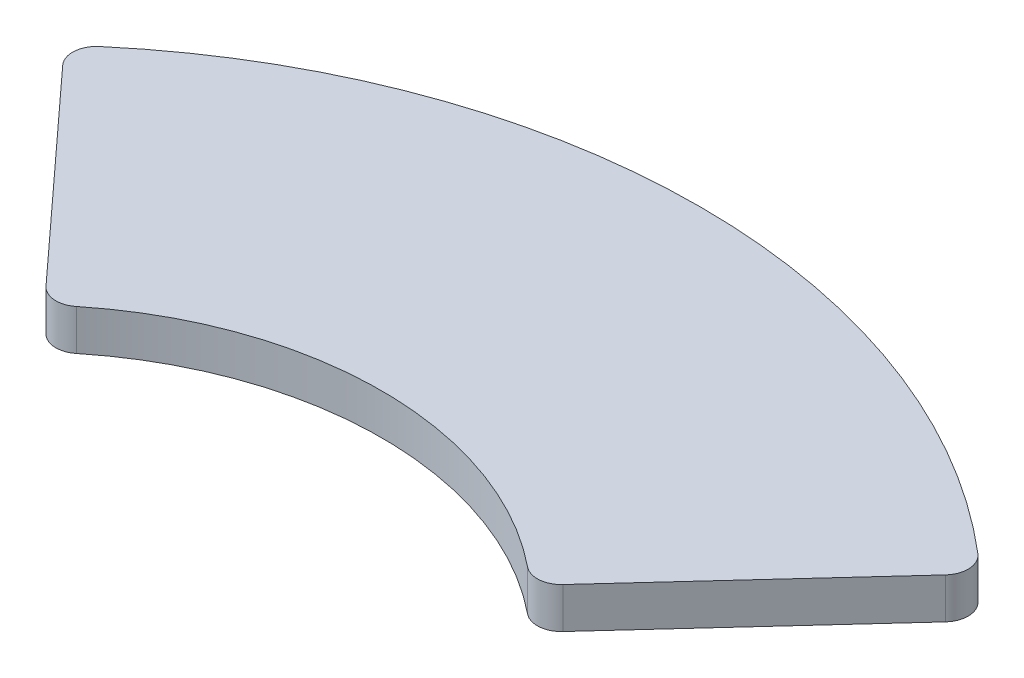
ISO-10303-21;
HEADER;
FILE_DESCRIPTION(('STEP AP214'),'2;1');
FILE_NAME('part.step','',(''),(''),'','','');
FILE_SCHEMA(('AUTOMOTIVE_DESIGN { 1 0 10303 214 1 1 1 1 }'));
ENDSEC;
DATA;
#1=APPLICATION_CONTEXT('core data for automotive mechanical design processes');
#2=APPLICATION_PROTOCOL_DEFINITION('international standard','automotive_design',2000,#1);
#3=PRODUCT_CONTEXT('',#1,'mechanical');
#4=PRODUCT('Part','Part','',(#3));
#5=PRODUCT_RELATED_PRODUCT_CATEGORY('part','',(#4));
#6=PRODUCT_DEFINITION_FORMATION('','',#4);
#7=PRODUCT_DEFINITION_CONTEXT('part definition',#1,'design');
#8=PRODUCT_DEFINITION('design','',#6,#7);
#9=PRODUCT_DEFINITION_SHAPE('','',#8);
#10=(LENGTH_UNIT() NAMED_UNIT(*) SI_UNIT(.MILLI.,.METRE.));
#11=(NAMED_UNIT(*) PLANE_ANGLE_UNIT() SI_UNIT($,.RADIAN.));
#12=(NAMED_UNIT(*) SI_UNIT($,.STERADIAN.) SOLID_ANGLE_UNIT());
#13=UNCERTAINTY_MEASURE_WITH_UNIT(LENGTH_MEASURE(1.E-05),#10,'distance_accuracy_value','');
#14=(GEOMETRIC_REPRESENTATION_CONTEXT(3) GLOBAL_UNCERTAINTY_ASSIGNED_CONTEXT((#13)) GLOBAL_UNIT_ASSIGNED_CONTEXT((#10,
#11,#12)) REPRESENTATION_CONTEXT('',''));
#15=CARTESIAN_POINT('',(0.,0.,0.));
#16=DIRECTION('',(0.,0.,1.));
#17=DIRECTION('',(1.,0.,0.));
#18=AXIS2_PLACEMENT_3D('',#15,#16,#17);
#19=CARTESIAN_POINT('',(0.,0.85,21.65));
#20=DIRECTION('',(0.,-1.,0.));
#21=DIRECTION('',(0.,0.,-1.));
#22=AXIS2_PLACEMENT_3D('',#19,#20,#21);
#23=CYLINDRICAL_SURFACE('',#22,15.);
#24=CARTESIAN_POINT('',(0.,-0.85,21.65));
#25=DIRECTION('',(0.,-1.,0.));
#26=DIRECTION('',(0.,0.,-1.));
#27=AXIS2_PLACEMENT_3D('',#24,#25,#26);
#28=CIRCLE('',#27,15.);
#29=CARTESIAN_POINT('',(-9.42284356247684,-0.85,9.97909518515858));
#30=VERTEX_POINT('',#29);
#31=CARTESIAN_POINT('',(9.42284356247684,-0.85,9.97909518515858));
#32=VERTEX_POINT('',#31);
#33=EDGE_CURVE('E140',#30,#32,#28,.T.);
#34=ORIENTED_EDGE('',*,*,#33,.T.);
#35=DIRECTION('',(0.,-1.,0.));
#36=VECTOR('',#35,1.);
#37=CARTESIAN_POINT('',(9.42284356247684,0.85,9.97909518515858));
#38=LINE('',#37,#36);
#39=CARTESIAN_POINT('',(9.42284356247684,0.85,9.97909518515858));
#40=VERTEX_POINT('',#39);
#41=EDGE_CURVE('E174',#32,#40,#38,.F.);
#42=ORIENTED_EDGE('',*,*,#41,.T.);
#43=CARTESIAN_POINT('',(0.,0.85,21.65));
#44=DIRECTION('',(0.,-1.,0.));
#45=DIRECTION('',(0.,0.,-1.));
#46=AXIS2_PLACEMENT_3D('',#43,#44,#45);
#47=CIRCLE('',#46,15.);
#48=CARTESIAN_POINT('',(-9.42284356247684,0.85,9.97909518515858));
#49=VERTEX_POINT('',#48);
#50=EDGE_CURVE('E138',#49,#40,#47,.T.);
#51=ORIENTED_EDGE('',*,*,#50,.F.);
#52=DIRECTION('',(0.,-1.,0.));
#53=VECTOR('',#52,1.);
#54=CARTESIAN_POINT('',(-9.42284356247684,0.85,9.97909518515858));
#55=LINE('',#54,#53);
#56=EDGE_CURVE('E170',#49,#30,#55,.T.);
#57=ORIENTED_EDGE('',*,*,#56,.T.);
#58=EDGE_LOOP('',(#34,#42,#51,#57));
#59=FACE_BOUND('',#58,.T.);
#60=ADVANCED_FACE('F39',(#59),#23,.F.);
#61=CARTESIAN_POINT('',(10.1338531142349,0.85,10.5908399478482));
#62=DIRECTION('',(-0.737277336810123,0.,-0.675590207615661));
#63=DIRECTION('',(-0.675590207615661,0.,0.737277336810123));
#64=AXIS2_PLACEMENT_3D('',#61,#62,#63);
#65=PLANE('',#64);
#66=DIRECTION('',(0.675590207615661,0.,-0.737277336810123));
#67=VECTOR('',#66,1.);
#68=CARTESIAN_POINT('',(10.1338531142349,-0.85,10.5908399478482));
#69=LINE('',#68,#67);
#70=CARTESIAN_POINT('',(10.7883104701188,-0.85,9.87662507178481));
#71=VERTEX_POINT('',#70);
#72=CARTESIAN_POINT('',(18.431235067547,-0.85,1.53583648557996));
#73=VERTEX_POINT('',#72);
#74=EDGE_CURVE('E134',#71,#73,#69,.T.);
#75=ORIENTED_EDGE('',*,*,#74,.T.);
#76=DIRECTION('',(0.,-1.,0.));
#77=VECTOR('',#76,1.);
#78=CARTESIAN_POINT('',(18.431235067547,0.85,1.53583648557996));
#79=LINE('',#78,#77);
#80=CARTESIAN_POINT('',(18.431235067547,0.85,1.53583648557996));
#81=VERTEX_POINT('',#80);
#82=EDGE_CURVE('E110',#73,#81,#79,.F.);
#83=ORIENTED_EDGE('',*,*,#82,.T.);
#84=DIRECTION('',(0.675590207615661,0.,-0.737277336810123));
#85=VECTOR('',#84,1.);
#86=CARTESIAN_POINT('',(10.1338531142349,0.85,10.5908399478482));
#87=LINE('',#86,#85);
#88=CARTESIAN_POINT('',(10.7883104701188,0.85,9.87662507178481));
#89=VERTEX_POINT('',#88);
#90=EDGE_CURVE('E193',#89,#81,#87,.T.);
#91=ORIENTED_EDGE('',*,*,#90,.F.);
#92=DIRECTION('',(0.,-1.,0.));
#93=VECTOR('',#92,1.);
#94=CARTESIAN_POINT('',(10.7883104701188,0.85,9.87662507178481));
#95=LINE('',#94,#93);
#96=EDGE_CURVE('E116',#89,#71,#95,.T.);
#97=ORIENTED_EDGE('',*,*,#96,.T.);
#98=EDGE_LOOP('',(#75,#83,#91,#97));
#99=FACE_BOUND('',#98,.T.);
#100=ADVANCED_FACE('F214',(#99),#65,.F.);
#101=CARTESIAN_POINT('',(0.,0.85,21.65));
#102=DIRECTION('',(0.,-1.,0.));
#103=DIRECTION('',(0.,0.,-1.));
#104=AXIS2_PLACEMENT_3D('',#101,#102,#103);
#105=CYLINDRICAL_SURFACE('',#104,28.3);
#106=CARTESIAN_POINT('',(0.,0.85,21.65));
#107=DIRECTION('',(0.,1.,0.));
#108=DIRECTION('',(0.,0.,-1.));
#109=AXIS2_PLACEMENT_3D('',#106,#107,#108);
#110=CIRCLE('',#109,28.3);
#111=CARTESIAN_POINT('',(18.3420880505441,0.85,0.0987168375967025));
#112=VERTEX_POINT('',#111);
#113=CARTESIAN_POINT('',(-18.3420880505441,0.85,0.0987168375967025));
#114=VERTEX_POINT('',#113);
#115=EDGE_CURVE('E125',#112,#114,#110,.T.);
#116=ORIENTED_EDGE('',*,*,#115,.F.);
#117=DIRECTION('',(0.,-1.,0.));
#118=VECTOR('',#117,1.);
#119=CARTESIAN_POINT('',(18.3420880505441,0.85,0.0987168375966956));
#120=LINE('',#119,#118);
#121=CARTESIAN_POINT('',(18.3420880505441,-0.85,0.0987168375967025));
#122=VERTEX_POINT('',#121);
#123=EDGE_CURVE('E109',#112,#122,#120,.T.);
#124=ORIENTED_EDGE('',*,*,#123,.T.);
#125=CARTESIAN_POINT('',(0.,-0.85,21.65));
#126=DIRECTION('',(0.,1.,0.));
#127=DIRECTION('',(0.,0.,-1.));
#128=AXIS2_PLACEMENT_3D('',#125,#126,#127);
#129=CIRCLE('',#128,28.3);
#130=CARTESIAN_POINT('',(-18.3420880505441,-0.85,0.0987168375967025));
#131=VERTEX_POINT('',#130);
#132=EDGE_CURVE('E123',#122,#131,#129,.T.);
#133=ORIENTED_EDGE('',*,*,#132,.T.);
#134=DIRECTION('',(0.,-1.,0.));
#135=VECTOR('',#134,1.);
#136=CARTESIAN_POINT('',(-18.3420880505441,0.85,0.098716837596699));
#137=LINE('',#136,#135);
#138=EDGE_CURVE('E128',#131,#114,#137,.F.);
#139=ORIENTED_EDGE('',*,*,#138,.T.);
#140=EDGE_LOOP('',(#116,#124,#133,#139));
#141=FACE_BOUND('',#140,.T.);
#142=ADVANCED_FACE('F122',(#141),#105,.T.);
#143=CARTESIAN_POINT('',(-10.1338531142349,0.85,10.5908399478482));
#144=DIRECTION('',(0.737277336810123,0.,-0.675590207615661));
#145=DIRECTION('',(-0.675590207615661,0.,-0.737277336810123));
#146=AXIS2_PLACEMENT_3D('',#143,#144,#145);
#147=PLANE('',#146);
#148=DIRECTION('',(0.675590207615661,0.,0.737277336810123));
#149=VECTOR('',#148,1.);
#150=CARTESIAN_POINT('',(-10.1338531142349,-0.85,10.5908399478482));
#151=LINE('',#150,#149);
#152=CARTESIAN_POINT('',(-18.431235067547,-0.85,1.53583648557997));
#153=VERTEX_POINT('',#152);
#154=CARTESIAN_POINT('',(-10.7883104701188,-0.85,9.87662507178481));
#155=VERTEX_POINT('',#154);
#156=EDGE_CURVE('E133',#153,#155,#151,.T.);
#157=ORIENTED_EDGE('',*,*,#156,.T.);
#158=DIRECTION('',(0.,-1.,0.));
#159=VECTOR('',#158,1.);
#160=CARTESIAN_POINT('',(-10.7883104701188,0.85,9.87662507178481));
#161=LINE('',#160,#159);
#162=CARTESIAN_POINT('',(-10.7883104701188,0.85,9.87662507178481));
#163=VERTEX_POINT('',#162);
#164=EDGE_CURVE('E11',#155,#163,#161,.F.);
#165=ORIENTED_EDGE('',*,*,#164,.T.);
#166=DIRECTION('',(0.675590207615661,0.,0.737277336810123));
#167=VECTOR('',#166,1.);
#168=CARTESIAN_POINT('',(-10.1338531142349,0.85,10.5908399478482));
#169=LINE('',#168,#167);
#170=CARTESIAN_POINT('',(-18.431235067547,0.85,1.53583648557997));
#171=VERTEX_POINT('',#170);
#172=EDGE_CURVE('E145',#171,#163,#169,.T.);
#173=ORIENTED_EDGE('',*,*,#172,.F.);
#174=DIRECTION('',(0.,-1.,0.));
#175=VECTOR('',#174,1.);
#176=CARTESIAN_POINT('',(-18.431235067547,0.85,1.53583648557997));
#177=LINE('',#176,#175);
#178=EDGE_CURVE('E48',#171,#153,#177,.T.);
#179=ORIENTED_EDGE('',*,*,#178,.T.);
#180=EDGE_LOOP('',(#157,#165,#173,#179));
#181=FACE_BOUND('',#180,.T.);
#182=ADVANCED_FACE('F179',(#181),#147,.F.);
#183=CARTESIAN_POINT('',(0.,0.85,21.65));
#184=DIRECTION('',(0.,-1.,0.));
#185=DIRECTION('',(0.,0.,-1.));
#186=AXIS2_PLACEMENT_3D('',#183,#184,#185);
#187=PLANE('',#186);
#188=ORIENTED_EDGE('',*,*,#90,.T.);
#189=CARTESIAN_POINT('',(17.6939577307369,0.85,0.860246277964306));
#190=DIRECTION('',(0.,-1.,0.));
#191=DIRECTION('',(0.,0.,-1.));
#192=AXIS2_PLACEMENT_3D('',#189,#190,#191);
#193=CIRCLE('',#192,1.);
#194=EDGE_CURVE('E167',#81,#112,#193,.F.);
#195=ORIENTED_EDGE('',*,*,#194,.T.);
#196=ORIENTED_EDGE('',*,*,#115,.T.);
#197=CARTESIAN_POINT('',(-17.6939577307369,0.85,0.86024627796431));
#198=DIRECTION('',(0.,-1.,0.));
#199=DIRECTION('',(0.,0.,-1.));
#200=AXIS2_PLACEMENT_3D('',#197,#198,#199);
#201=CIRCLE('',#200,1.);
#202=EDGE_CURVE('E60',#114,#171,#201,.F.);
#203=ORIENTED_EDGE('',*,*,#202,.T.);
#204=ORIENTED_EDGE('',*,*,#172,.T.);
#205=CARTESIAN_POINT('',(-10.0510331333086,0.85,9.20103486416915));
#206=DIRECTION('',(0.,-1.,0.));
#207=DIRECTION('',(0.,0.,-1.));
#208=AXIS2_PLACEMENT_3D('',#205,#206,#207);
#209=CIRCLE('',#208,1.);
#210=EDGE_CURVE('E161',#163,#49,#209,.F.);
#211=ORIENTED_EDGE('',*,*,#210,.T.);
#212=ORIENTED_EDGE('',*,*,#50,.T.);
#213=CARTESIAN_POINT('',(10.0510331333086,0.85,9.20103486416915));
#214=DIRECTION('',(0.,-1.,0.));
#215=DIRECTION('',(0.,0.,-1.));
#216=AXIS2_PLACEMENT_3D('',#213,#214,#215);
#217=CIRCLE('',#216,1.);
#218=EDGE_CURVE('E164',#40,#89,#217,.F.);
#219=ORIENTED_EDGE('',*,*,#218,.T.);
#220=EDGE_LOOP('',(#188,#195,#196,#203,#204,#211,#212,#219));
#221=FACE_BOUND('',#220,.T.);
#222=ADVANCED_FACE('F203',(#221),#187,.F.);
#223=CARTESIAN_POINT('',(0.,-0.85,21.65));
#224=DIRECTION('',(0.,-1.,0.));
#225=DIRECTION('',(0.,0.,-1.));
#226=AXIS2_PLACEMENT_3D('',#223,#224,#225);
#227=PLANE('',#226);
#228=ORIENTED_EDGE('',*,*,#132,.F.);
#229=CARTESIAN_POINT('',(17.6939577307369,-0.85,0.860246277964306));
#230=DIRECTION('',(0.,-1.,0.));
#231=DIRECTION('',(0.,0.,-1.));
#232=AXIS2_PLACEMENT_3D('',#229,#230,#231);
#233=CIRCLE('',#232,1.);
#234=EDGE_CURVE('E105',#122,#73,#233,.T.);
#235=ORIENTED_EDGE('',*,*,#234,.T.);
#236=ORIENTED_EDGE('',*,*,#74,.F.);
#237=CARTESIAN_POINT('',(10.0510331333086,-0.85,9.20103486416915));
#238=DIRECTION('',(0.,-1.,0.));
#239=DIRECTION('',(0.,0.,-1.));
#240=AXIS2_PLACEMENT_3D('',#237,#238,#239);
#241=CIRCLE('',#240,1.);
#242=EDGE_CURVE('E117',#71,#32,#241,.T.);
#243=ORIENTED_EDGE('',*,*,#242,.T.);
#244=ORIENTED_EDGE('',*,*,#33,.F.);
#245=CARTESIAN_POINT('',(-10.0510331333086,-0.85,9.20103486416915));
#246=DIRECTION('',(0.,-1.,0.));
#247=DIRECTION('',(0.,0.,-1.));
#248=AXIS2_PLACEMENT_3D('',#245,#246,#247);
#249=CIRCLE('',#248,1.);
#250=EDGE_CURVE('E149',#30,#155,#249,.T.);
#251=ORIENTED_EDGE('',*,*,#250,.T.);
#252=ORIENTED_EDGE('',*,*,#156,.F.);
#253=CARTESIAN_POINT('',(-17.6939577307369,-0.85,0.86024627796431));
#254=DIRECTION('',(0.,-1.,0.));
#255=DIRECTION('',(0.,0.,-1.));
#256=AXIS2_PLACEMENT_3D('',#253,#254,#255);
#257=CIRCLE('',#256,1.);
#258=EDGE_CURVE('E127',#153,#131,#257,.T.);
#259=ORIENTED_EDGE('',*,*,#258,.T.);
#260=EDGE_LOOP('',(#228,#235,#236,#243,#244,#251,#252,#259));
#261=FACE_BOUND('',#260,.T.);
#262=ADVANCED_FACE('F130',(#261),#227,.T.);
#263=CARTESIAN_POINT('',(17.6939577307369,0.85,0.860246277964306));
#264=DIRECTION('',(0.,-1.,0.));
#265=DIRECTION('',(0.,0.,-1.));
#266=AXIS2_PLACEMENT_3D('',#263,#264,#265);
#267=CYLINDRICAL_SURFACE('',#266,1.);
#268=ORIENTED_EDGE('',*,*,#194,.F.);
#269=ORIENTED_EDGE('',*,*,#82,.F.);
#270=ORIENTED_EDGE('',*,*,#234,.F.);
#271=ORIENTED_EDGE('',*,*,#123,.F.);
#272=EDGE_LOOP('',(#268,#269,#270,#271));
#273=FACE_BOUND('',#272,.T.);
#274=ADVANCED_FACE('F108',(#273),#267,.T.);
#275=CARTESIAN_POINT('',(10.0510331333086,0.85,9.20103486416915));
#276=DIRECTION('',(0.,-1.,0.));
#277=DIRECTION('',(0.,0.,-1.));
#278=AXIS2_PLACEMENT_3D('',#275,#276,#277);
#279=CYLINDRICAL_SURFACE('',#278,1.);
#280=ORIENTED_EDGE('',*,*,#218,.F.);
#281=ORIENTED_EDGE('',*,*,#41,.F.);
#282=ORIENTED_EDGE('',*,*,#242,.F.);
#283=ORIENTED_EDGE('',*,*,#96,.F.);
#284=EDGE_LOOP('',(#280,#281,#282,#283));
#285=FACE_BOUND('',#284,.T.);
#286=ADVANCED_FACE('F225',(#285),#279,.T.);
#287=CARTESIAN_POINT('',(-10.0510331333086,0.85,9.20103486416915));
#288=DIRECTION('',(0.,-1.,0.));
#289=DIRECTION('',(0.,0.,-1.));
#290=AXIS2_PLACEMENT_3D('',#287,#288,#289);
#291=CYLINDRICAL_SURFACE('',#290,1.);
#292=ORIENTED_EDGE('',*,*,#210,.F.);
#293=ORIENTED_EDGE('',*,*,#164,.F.);
#294=ORIENTED_EDGE('',*,*,#250,.F.);
#295=ORIENTED_EDGE('',*,*,#56,.F.);
#296=EDGE_LOOP('',(#292,#293,#294,#295));
#297=FACE_BOUND('',#296,.T.);
#298=ADVANCED_FACE('F186',(#297),#291,.T.);
#299=CARTESIAN_POINT('',(-17.6939577307369,0.85,0.86024627796431));
#300=DIRECTION('',(0.,-1.,0.));
#301=DIRECTION('',(0.,0.,-1.));
#302=AXIS2_PLACEMENT_3D('',#299,#300,#301);
#303=CYLINDRICAL_SURFACE('',#302,1.);
#304=ORIENTED_EDGE('',*,*,#202,.F.);
#305=ORIENTED_EDGE('',*,*,#138,.F.);
#306=ORIENTED_EDGE('',*,*,#258,.F.);
#307=ORIENTED_EDGE('',*,*,#178,.F.);
#308=EDGE_LOOP('',(#304,#305,#306,#307));
#309=FACE_BOUND('',#308,.T.);
#310=ADVANCED_FACE('F41',(#309),#303,.T.);
#311=CLOSED_SHELL('',(#60,#100,#142,#182,#222,#262,#274,#286,#298,#310));
#312=MANIFOLD_SOLID_BREP('B2',#311);
#313=ADVANCED_BREP_SHAPE_REPRESENTATION('',(#18,#312),#14);
#314=SHAPE_DEFINITION_REPRESENTATION(#9,#313);
ENDSEC;
END-ISO-10303-21;
